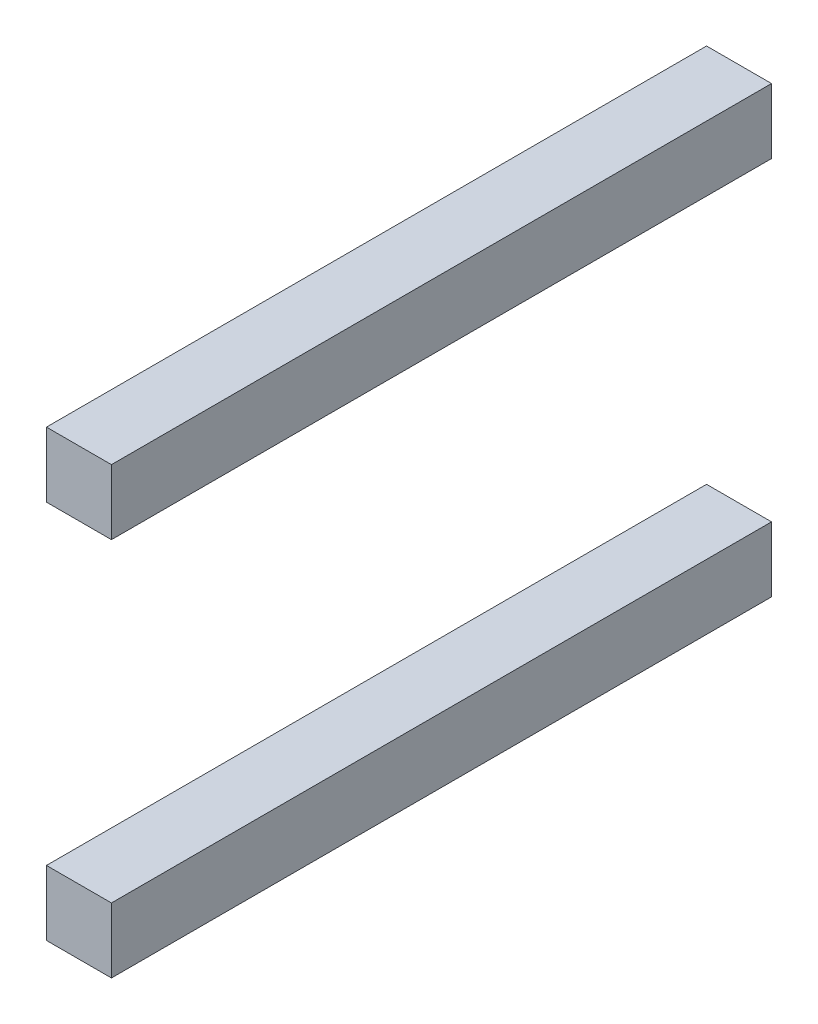
ISO-10303-21;
HEADER;
FILE_DESCRIPTION(('STEP AP214'),'2;1');
FILE_NAME('part.step','',(''),(''),'','','');
FILE_SCHEMA(('AUTOMOTIVE_DESIGN { 1 0 10303 214 1 1 1 1 }'));
ENDSEC;
DATA;
#1=APPLICATION_CONTEXT('core data for automotive mechanical design processes');
#2=APPLICATION_PROTOCOL_DEFINITION('international standard','automotive_design',2000,#1);
#3=PRODUCT_CONTEXT('',#1,'mechanical');
#4=PRODUCT('Part','Part','',(#3));
#5=PRODUCT_RELATED_PRODUCT_CATEGORY('part','',(#4));
#6=PRODUCT_DEFINITION_FORMATION('','',#4);
#7=PRODUCT_DEFINITION_CONTEXT('part definition',#1,'design');
#8=PRODUCT_DEFINITION('design','',#6,#7);
#9=PRODUCT_DEFINITION_SHAPE('','',#8);
#10=(LENGTH_UNIT() NAMED_UNIT(*) SI_UNIT(.MILLI.,.METRE.));
#11=(NAMED_UNIT(*) PLANE_ANGLE_UNIT() SI_UNIT($,.RADIAN.));
#12=(NAMED_UNIT(*) SI_UNIT($,.STERADIAN.) SOLID_ANGLE_UNIT());
#13=UNCERTAINTY_MEASURE_WITH_UNIT(LENGTH_MEASURE(1.E-05),#10,'distance_accuracy_value','');
#14=(GEOMETRIC_REPRESENTATION_CONTEXT(3) GLOBAL_UNCERTAINTY_ASSIGNED_CONTEXT((#13)) GLOBAL_UNIT_ASSIGNED_CONTEXT((#10,
#11,#12)) REPRESENTATION_CONTEXT('',''));
#15=CARTESIAN_POINT('',(0.,0.,0.));
#16=DIRECTION('',(0.,0.,1.));
#17=DIRECTION('',(1.,0.,0.));
#18=AXIS2_PLACEMENT_3D('',#15,#16,#17);
#19=CARTESIAN_POINT('',(0.,0.,0.));
#20=DIRECTION('',(0.,0.,1.));
#21=DIRECTION('',(1.,0.,0.));
#22=AXIS2_PLACEMENT_3D('',#19,#20,#21);
#23=PLANE('',#22);
#24=DIRECTION('',(1.,0.,0.));
#25=VECTOR('',#24,1.);
#26=CARTESIAN_POINT('',(3.95320454429543,11.8745,0.));
#27=LINE('',#26,#25);
#28=CARTESIAN_POINT('',(3.95320454429543,11.8745,0.));
#29=VERTEX_POINT('',#28);
#30=CARTESIAN_POINT('',(13.4782045442954,11.8745,0.));
#31=VERTEX_POINT('',#30);
#32=EDGE_CURVE('E93',#29,#31,#27,.T.);
#33=ORIENTED_EDGE('',*,*,#32,.F.);
#34=DIRECTION('',(0.,-1.,0.));
#35=VECTOR('',#34,1.);
#36=CARTESIAN_POINT('',(3.95320454429543,11.8745,0.));
#37=LINE('',#36,#35);
#38=CARTESIAN_POINT('',(3.95320454429544,21.3995,0.));
#39=VERTEX_POINT('',#38);
#40=EDGE_CURVE('E104',#39,#29,#37,.T.);
#41=ORIENTED_EDGE('',*,*,#40,.F.);
#42=DIRECTION('',(-1.,0.,0.));
#43=VECTOR('',#42,1.);
#44=CARTESIAN_POINT('',(3.95320454429544,21.3995,0.));
#45=LINE('',#44,#43);
#46=CARTESIAN_POINT('',(13.4782045442954,21.3995,0.));
#47=VERTEX_POINT('',#46);
#48=EDGE_CURVE('E95',#47,#39,#45,.T.);
#49=ORIENTED_EDGE('',*,*,#48,.F.);
#50=DIRECTION('',(0.,1.,0.));
#51=VECTOR('',#50,1.);
#52=CARTESIAN_POINT('',(13.4782045442954,11.8745,0.));
#53=LINE('',#52,#51);
#54=EDGE_CURVE('E85',#31,#47,#53,.T.);
#55=ORIENTED_EDGE('',*,*,#54,.F.);
#56=EDGE_LOOP('',(#33,#41,#49,#55));
#57=FACE_BOUND('',#56,.T.);
#58=ADVANCED_FACE('F43',(#57),#23,.F.);
#59=CARTESIAN_POINT('',(3.95320454429543,11.8745,110.20205084827));
#60=DIRECTION('',(1.,0.,0.));
#61=DIRECTION('',(0.,1.,0.));
#62=AXIS2_PLACEMENT_3D('',#59,#60,#61);
#63=PLANE('',#62);
#64=DIRECTION('',(0.,0.,-1.));
#65=VECTOR('',#64,1.);
#66=CARTESIAN_POINT('',(3.95320454429543,11.8745,110.20205084827));
#67=LINE('',#66,#65);
#68=CARTESIAN_POINT('',(3.95320454429543,11.8745,96.7316666666667));
#69=VERTEX_POINT('',#68);
#70=EDGE_CURVE('E98',#69,#29,#67,.T.);
#71=ORIENTED_EDGE('',*,*,#70,.F.);
#72=DIRECTION('',(0.,1.,0.));
#73=VECTOR('',#72,1.);
#74=CARTESIAN_POINT('',(3.95320454429543,11.8745,96.7316666666667));
#75=LINE('',#74,#73);
#76=CARTESIAN_POINT('',(3.95320454429544,21.3995,96.7316666666667));
#77=VERTEX_POINT('',#76);
#78=EDGE_CURVE('E47',#69,#77,#75,.T.);
#79=ORIENTED_EDGE('',*,*,#78,.T.);
#80=DIRECTION('',(0.,0.,-1.));
#81=VECTOR('',#80,1.);
#82=CARTESIAN_POINT('',(3.95320454429544,21.3995,110.20205084827));
#83=LINE('',#82,#81);
#84=EDGE_CURVE('E107',#77,#39,#83,.T.);
#85=ORIENTED_EDGE('',*,*,#84,.T.);
#86=ORIENTED_EDGE('',*,*,#40,.T.);
#87=EDGE_LOOP('',(#71,#79,#85,#86));
#88=FACE_BOUND('',#87,.T.);
#89=ADVANCED_FACE('F116',(#88),#63,.F.);
#90=CARTESIAN_POINT('',(3.95320454429544,21.3995,110.20205084827));
#91=DIRECTION('',(0.,-1.,0.));
#92=DIRECTION('',(1.,0.,0.));
#93=AXIS2_PLACEMENT_3D('',#90,#91,#92);
#94=PLANE('',#93);
#95=ORIENTED_EDGE('',*,*,#84,.F.);
#96=DIRECTION('',(1.,0.,0.));
#97=VECTOR('',#96,1.);
#98=CARTESIAN_POINT('',(3.95320454429544,21.3995,96.7316666666667));
#99=LINE('',#98,#97);
#100=CARTESIAN_POINT('',(13.4782045442954,21.3995,96.7316666666667));
#101=VERTEX_POINT('',#100);
#102=EDGE_CURVE('E113',#77,#101,#99,.T.);
#103=ORIENTED_EDGE('',*,*,#102,.T.);
#104=DIRECTION('',(0.,0.,-1.));
#105=VECTOR('',#104,1.);
#106=CARTESIAN_POINT('',(13.4782045442954,21.3995,110.20205084827));
#107=LINE('',#106,#105);
#108=EDGE_CURVE('E89',#101,#47,#107,.T.);
#109=ORIENTED_EDGE('',*,*,#108,.T.);
#110=ORIENTED_EDGE('',*,*,#48,.T.);
#111=EDGE_LOOP('',(#95,#103,#109,#110));
#112=FACE_BOUND('',#111,.T.);
#113=ADVANCED_FACE('F112',(#112),#94,.F.);
#114=CARTESIAN_POINT('',(13.4782045442954,11.8745,110.20205084827));
#115=DIRECTION('',(-1.,0.,0.));
#116=DIRECTION('',(0.,-1.,0.));
#117=AXIS2_PLACEMENT_3D('',#114,#115,#116);
#118=PLANE('',#117);
#119=ORIENTED_EDGE('',*,*,#108,.F.);
#120=DIRECTION('',(0.,-1.,0.));
#121=VECTOR('',#120,1.);
#122=CARTESIAN_POINT('',(13.4782045442954,11.8745,96.7316666666667));
#123=LINE('',#122,#121);
#124=CARTESIAN_POINT('',(13.4782045442954,11.8745,96.7316666666667));
#125=VERTEX_POINT('',#124);
#126=EDGE_CURVE('E52',#101,#125,#123,.T.);
#127=ORIENTED_EDGE('',*,*,#126,.T.);
#128=DIRECTION('',(0.,0.,-1.));
#129=VECTOR('',#128,1.);
#130=CARTESIAN_POINT('',(13.4782045442954,11.8745,110.20205084827));
#131=LINE('',#130,#129);
#132=EDGE_CURVE('E82',#125,#31,#131,.T.);
#133=ORIENTED_EDGE('',*,*,#132,.T.);
#134=ORIENTED_EDGE('',*,*,#54,.T.);
#135=EDGE_LOOP('',(#119,#127,#133,#134));
#136=FACE_BOUND('',#135,.T.);
#137=ADVANCED_FACE('F84',(#136),#118,.F.);
#138=CARTESIAN_POINT('',(3.95320454429543,11.8745,110.20205084827));
#139=DIRECTION('',(0.,1.,0.));
#140=DIRECTION('',(0.,0.,1.));
#141=AXIS2_PLACEMENT_3D('',#138,#139,#140);
#142=PLANE('',#141);
#143=ORIENTED_EDGE('',*,*,#132,.F.);
#144=DIRECTION('',(-1.,0.,0.));
#145=VECTOR('',#144,1.);
#146=CARTESIAN_POINT('',(3.95320454429543,11.8745,96.7316666666667));
#147=LINE('',#146,#145);
#148=EDGE_CURVE('E12',#125,#69,#147,.T.);
#149=ORIENTED_EDGE('',*,*,#148,.T.);
#150=ORIENTED_EDGE('',*,*,#70,.T.);
#151=ORIENTED_EDGE('',*,*,#32,.T.);
#152=EDGE_LOOP('',(#143,#149,#150,#151));
#153=FACE_BOUND('',#152,.T.);
#154=ADVANCED_FACE('F45',(#153),#142,.F.);
#155=CARTESIAN_POINT('',(0.,0.,96.7316666666667));
#156=DIRECTION('',(0.,0.,-1.));
#157=DIRECTION('',(0.,1.,0.));
#158=AXIS2_PLACEMENT_3D('',#155,#156,#157);
#159=PLANE('',#158);
#160=ORIENTED_EDGE('',*,*,#126,.F.);
#161=ORIENTED_EDGE('',*,*,#102,.F.);
#162=ORIENTED_EDGE('',*,*,#78,.F.);
#163=ORIENTED_EDGE('',*,*,#148,.F.);
#164=EDGE_LOOP('',(#160,#161,#162,#163));
#165=FACE_BOUND('',#164,.T.);
#166=ADVANCED_FACE('F130',(#165),#159,.F.);
#167=CLOSED_SHELL('',(#58,#89,#113,#137,#154,#166));
#168=MANIFOLD_SOLID_BREP('B2',#167);
#169=CARTESIAN_POINT('',(0.,0.,0.));
#170=DIRECTION('',(0.,0.,1.));
#171=DIRECTION('',(1.,0.,0.));
#172=AXIS2_PLACEMENT_3D('',#169,#170,#171);
#173=PLANE('',#172);
#174=DIRECTION('',(0.,-1.,0.));
#175=VECTOR('',#174,1.);
#176=CARTESIAN_POINT('',(3.95320454429544,77.0255,0.));
#177=LINE('',#176,#175);
#178=CARTESIAN_POINT('',(3.95320454429544,77.0255,0.));
#179=VERTEX_POINT('',#178);
#180=CARTESIAN_POINT('',(3.95320454429544,67.5005,0.));
#181=VERTEX_POINT('',#180);
#182=EDGE_CURVE('E217',#179,#181,#177,.T.);
#183=ORIENTED_EDGE('',*,*,#182,.F.);
#184=DIRECTION('',(-1.,0.,0.));
#185=VECTOR('',#184,1.);
#186=CARTESIAN_POINT('',(3.95320454429544,77.0255,0.));
#187=LINE('',#186,#185);
#188=CARTESIAN_POINT('',(13.4782045442954,77.0255,0.));
#189=VERTEX_POINT('',#188);
#190=EDGE_CURVE('E228',#189,#179,#187,.T.);
#191=ORIENTED_EDGE('',*,*,#190,.F.);
#192=DIRECTION('',(0.,1.,0.));
#193=VECTOR('',#192,1.);
#194=CARTESIAN_POINT('',(13.4782045442954,77.0255,0.));
#195=LINE('',#194,#193);
#196=CARTESIAN_POINT('',(13.4782045442954,67.5005,0.));
#197=VERTEX_POINT('',#196);
#198=EDGE_CURVE('E219',#197,#189,#195,.T.);
#199=ORIENTED_EDGE('',*,*,#198,.F.);
#200=DIRECTION('',(1.,0.,0.));
#201=VECTOR('',#200,1.);
#202=CARTESIAN_POINT('',(3.95320454429544,67.5005,0.));
#203=LINE('',#202,#201);
#204=EDGE_CURVE('E209',#181,#197,#203,.T.);
#205=ORIENTED_EDGE('',*,*,#204,.F.);
#206=EDGE_LOOP('',(#183,#191,#199,#205));
#207=FACE_BOUND('',#206,.T.);
#208=ADVANCED_FACE('F167',(#207),#173,.F.);
#209=CARTESIAN_POINT('',(3.95320454429544,77.0255,110.20205084827));
#210=DIRECTION('',(0.,-1.,0.));
#211=DIRECTION('',(0.,0.,-1.));
#212=AXIS2_PLACEMENT_3D('',#209,#210,#211);
#213=PLANE('',#212);
#214=DIRECTION('',(0.,0.,-1.));
#215=VECTOR('',#214,1.);
#216=CARTESIAN_POINT('',(3.95320454429544,77.0255,110.20205084827));
#217=LINE('',#216,#215);
#218=CARTESIAN_POINT('',(3.95320454429544,77.0255,96.7316666666667));
#219=VERTEX_POINT('',#218);
#220=EDGE_CURVE('E222',#219,#179,#217,.T.);
#221=ORIENTED_EDGE('',*,*,#220,.F.);
#222=DIRECTION('',(1.,0.,0.));
#223=VECTOR('',#222,1.);
#224=CARTESIAN_POINT('',(3.95320454429544,77.0255,96.7316666666667));
#225=LINE('',#224,#223);
#226=CARTESIAN_POINT('',(13.4782045442954,77.0255,96.7316666666667));
#227=VERTEX_POINT('',#226);
#228=EDGE_CURVE('E171',#219,#227,#225,.T.);
#229=ORIENTED_EDGE('',*,*,#228,.T.);
#230=DIRECTION('',(0.,0.,-1.));
#231=VECTOR('',#230,1.);
#232=CARTESIAN_POINT('',(13.4782045442954,77.0255,110.20205084827));
#233=LINE('',#232,#231);
#234=EDGE_CURVE('E231',#227,#189,#233,.T.);
#235=ORIENTED_EDGE('',*,*,#234,.T.);
#236=ORIENTED_EDGE('',*,*,#190,.T.);
#237=EDGE_LOOP('',(#221,#229,#235,#236));
#238=FACE_BOUND('',#237,.T.);
#239=ADVANCED_FACE('F240',(#238),#213,.F.);
#240=CARTESIAN_POINT('',(13.4782045442954,77.0255,110.20205084827));
#241=DIRECTION('',(-1.,0.,0.));
#242=DIRECTION('',(0.,0.,1.));
#243=AXIS2_PLACEMENT_3D('',#240,#241,#242);
#244=PLANE('',#243);
#245=ORIENTED_EDGE('',*,*,#234,.F.);
#246=DIRECTION('',(0.,-1.,0.));
#247=VECTOR('',#246,1.);
#248=CARTESIAN_POINT('',(13.4782045442954,77.0255,96.7316666666667));
#249=LINE('',#248,#247);
#250=CARTESIAN_POINT('',(13.4782045442954,67.5005,96.7316666666667));
#251=VERTEX_POINT('',#250);
#252=EDGE_CURVE('E237',#227,#251,#249,.T.);
#253=ORIENTED_EDGE('',*,*,#252,.T.);
#254=DIRECTION('',(0.,0.,-1.));
#255=VECTOR('',#254,1.);
#256=CARTESIAN_POINT('',(13.4782045442954,67.5005,110.20205084827));
#257=LINE('',#256,#255);
#258=EDGE_CURVE('E213',#251,#197,#257,.T.);
#259=ORIENTED_EDGE('',*,*,#258,.T.);
#260=ORIENTED_EDGE('',*,*,#198,.T.);
#261=EDGE_LOOP('',(#245,#253,#259,#260));
#262=FACE_BOUND('',#261,.T.);
#263=ADVANCED_FACE('F236',(#262),#244,.F.);
#264=CARTESIAN_POINT('',(3.95320454429544,67.5005,110.20205084827));
#265=DIRECTION('',(0.,1.,0.));
#266=DIRECTION('',(0.,0.,1.));
#267=AXIS2_PLACEMENT_3D('',#264,#265,#266);
#268=PLANE('',#267);
#269=ORIENTED_EDGE('',*,*,#258,.F.);
#270=DIRECTION('',(-1.,0.,0.));
#271=VECTOR('',#270,1.);
#272=CARTESIAN_POINT('',(3.95320454429544,67.5005,96.7316666666667));
#273=LINE('',#272,#271);
#274=CARTESIAN_POINT('',(3.95320454429544,67.5005,96.7316666666667));
#275=VERTEX_POINT('',#274);
#276=EDGE_CURVE('E176',#251,#275,#273,.T.);
#277=ORIENTED_EDGE('',*,*,#276,.T.);
#278=DIRECTION('',(0.,0.,-1.));
#279=VECTOR('',#278,1.);
#280=CARTESIAN_POINT('',(3.95320454429544,67.5005,110.20205084827));
#281=LINE('',#280,#279);
#282=EDGE_CURVE('E206',#275,#181,#281,.T.);
#283=ORIENTED_EDGE('',*,*,#282,.T.);
#284=ORIENTED_EDGE('',*,*,#204,.T.);
#285=EDGE_LOOP('',(#269,#277,#283,#284));
#286=FACE_BOUND('',#285,.T.);
#287=ADVANCED_FACE('F208',(#286),#268,.F.);
#288=CARTESIAN_POINT('',(3.95320454429544,77.0255,110.20205084827));
#289=DIRECTION('',(1.,0.,0.));
#290=DIRECTION('',(0.,0.,-1.));
#291=AXIS2_PLACEMENT_3D('',#288,#289,#290);
#292=PLANE('',#291);
#293=ORIENTED_EDGE('',*,*,#282,.F.);
#294=DIRECTION('',(0.,1.,0.));
#295=VECTOR('',#294,1.);
#296=CARTESIAN_POINT('',(3.95320454429544,77.0255,96.7316666666667));
#297=LINE('',#296,#295);
#298=EDGE_CURVE('E41',#275,#219,#297,.T.);
#299=ORIENTED_EDGE('',*,*,#298,.T.);
#300=ORIENTED_EDGE('',*,*,#220,.T.);
#301=ORIENTED_EDGE('',*,*,#182,.T.);
#302=EDGE_LOOP('',(#293,#299,#300,#301));
#303=FACE_BOUND('',#302,.T.);
#304=ADVANCED_FACE('F169',(#303),#292,.F.);
#305=CARTESIAN_POINT('',(0.,0.,96.7316666666667));
#306=DIRECTION('',(0.,0.,-1.));
#307=DIRECTION('',(0.,1.,0.));
#308=AXIS2_PLACEMENT_3D('',#305,#306,#307);
#309=PLANE('',#308);
#310=ORIENTED_EDGE('',*,*,#276,.F.);
#311=ORIENTED_EDGE('',*,*,#252,.F.);
#312=ORIENTED_EDGE('',*,*,#228,.F.);
#313=ORIENTED_EDGE('',*,*,#298,.F.);
#314=EDGE_LOOP('',(#310,#311,#312,#313));
#315=FACE_BOUND('',#314,.T.);
#316=ADVANCED_FACE('F254',(#315),#309,.F.);
#317=CLOSED_SHELL('',(#208,#239,#263,#287,#304,#316));
#318=MANIFOLD_SOLID_BREP('B6',#317);
#319=ADVANCED_BREP_SHAPE_REPRESENTATION('',(#18,#168,#318),#14);
#320=SHAPE_DEFINITION_REPRESENTATION(#9,#319);
ENDSEC;
END-ISO-10303-21;
